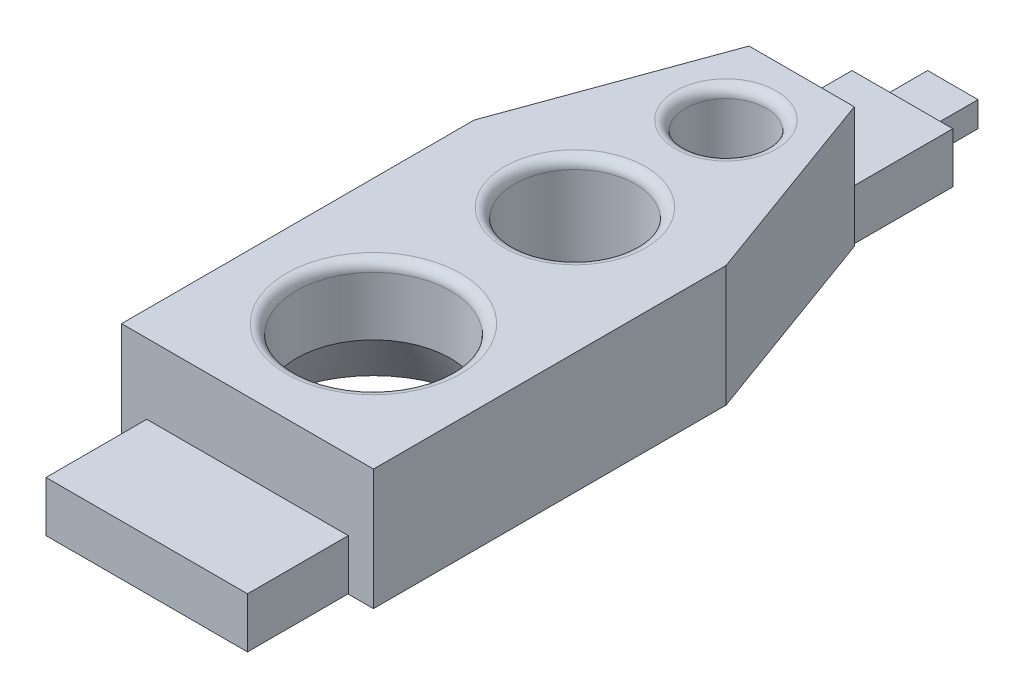
ISO-10303-21;
HEADER;
FILE_DESCRIPTION(('STEP AP214'),'2;1');
FILE_NAME('part.step','',(''),(''),'','','');
FILE_SCHEMA(('AUTOMOTIVE_DESIGN { 1 0 10303 214 1 1 1 1 }'));
ENDSEC;
DATA;
#1=APPLICATION_CONTEXT('core data for automotive mechanical design processes');
#2=APPLICATION_PROTOCOL_DEFINITION('international standard','automotive_design',2000,#1);
#3=PRODUCT_CONTEXT('',#1,'mechanical');
#4=PRODUCT('Part','Part','',(#3));
#5=PRODUCT_RELATED_PRODUCT_CATEGORY('part','',(#4));
#6=PRODUCT_DEFINITION_FORMATION('','',#4);
#7=PRODUCT_DEFINITION_CONTEXT('part definition',#1,'design');
#8=PRODUCT_DEFINITION('design','',#6,#7);
#9=PRODUCT_DEFINITION_SHAPE('','',#8);
#10=(LENGTH_UNIT() NAMED_UNIT(*) SI_UNIT(.MILLI.,.METRE.));
#11=(NAMED_UNIT(*) PLANE_ANGLE_UNIT() SI_UNIT($,.RADIAN.));
#12=(NAMED_UNIT(*) SI_UNIT($,.STERADIAN.) SOLID_ANGLE_UNIT());
#13=UNCERTAINTY_MEASURE_WITH_UNIT(LENGTH_MEASURE(1.E-05),#10,'distance_accuracy_value','');
#14=(GEOMETRIC_REPRESENTATION_CONTEXT(3) GLOBAL_UNCERTAINTY_ASSIGNED_CONTEXT((#13)) GLOBAL_UNIT_ASSIGNED_CONTEXT((#10,
#11,#12)) REPRESENTATION_CONTEXT('',''));
#15=CARTESIAN_POINT('',(0.,0.,0.));
#16=DIRECTION('',(0.,0.,1.));
#17=DIRECTION('',(1.,0.,0.));
#18=AXIS2_PLACEMENT_3D('',#15,#16,#17);
#19=CARTESIAN_POINT('',(0.,0.,4.25));
#20=DIRECTION('',(0.,0.,-1.));
#21=DIRECTION('',(-1.,0.,0.));
#22=AXIS2_PLACEMENT_3D('',#19,#20,#21);
#23=PLANE('',#22);
#24=DIRECTION('',(0.,-1.,0.));
#25=VECTOR('',#24,1.);
#26=CARTESIAN_POINT('',(-1.,0.502908482011137,4.25));
#27=LINE('',#26,#25);
#28=CARTESIAN_POINT('',(-1.,0.502908482011137,4.25));
#29=VERTEX_POINT('',#28);
#30=CARTESIAN_POINT('',(-1.,0.0029084820111366,4.25));
#31=VERTEX_POINT('',#30);
#32=EDGE_CURVE('E188',#29,#31,#27,.T.);
#33=ORIENTED_EDGE('',*,*,#32,.T.);
#34=DIRECTION('',(1.,0.,0.));
#35=VECTOR('',#34,1.);
#36=CARTESIAN_POINT('',(1.,0.00290848201113688,4.25));
#37=LINE('',#36,#35);
#38=CARTESIAN_POINT('',(1.,0.00290848201113688,4.25));
#39=VERTEX_POINT('',#38);
#40=EDGE_CURVE('E191',#31,#39,#37,.T.);
#41=ORIENTED_EDGE('',*,*,#40,.T.);
#42=DIRECTION('',(0.,1.,0.));
#43=VECTOR('',#42,1.);
#44=CARTESIAN_POINT('',(1.,0.502908482011137,4.25));
#45=LINE('',#44,#43);
#46=CARTESIAN_POINT('',(1.,0.502908482011137,4.25));
#47=VERTEX_POINT('',#46);
#48=EDGE_CURVE('E194',#39,#47,#45,.T.);
#49=ORIENTED_EDGE('',*,*,#48,.T.);
#50=DIRECTION('',(-1.,0.,0.));
#51=VECTOR('',#50,1.);
#52=CARTESIAN_POINT('',(1.,0.502908482011137,4.25));
#53=LINE('',#52,#51);
#54=EDGE_CURVE('E196',#47,#29,#53,.T.);
#55=ORIENTED_EDGE('',*,*,#54,.T.);
#56=EDGE_LOOP('',(#33,#41,#49,#55));
#57=FACE_BOUND('',#56,.T.);
#58=ADVANCED_FACE('F33',(#57),#23,.F.);
#59=CARTESIAN_POINT('',(0.,0.,-3.25));
#60=DIRECTION('',(0.,0.,1.));
#61=DIRECTION('',(1.,0.,0.));
#62=AXIS2_PLACEMENT_3D('',#59,#60,#61);
#63=PLANE('',#62);
#64=DIRECTION('',(0.,-1.,0.));
#65=VECTOR('',#64,1.);
#66=CARTESIAN_POINT('',(0.499999999999999,0.500555680922726,-3.25));
#67=LINE('',#66,#65);
#68=CARTESIAN_POINT('',(0.499999999999999,0.500555680922726,-3.25));
#69=VERTEX_POINT('',#68);
#70=CARTESIAN_POINT('',(0.499999999999999,0.000555680922726255,-3.25));
#71=VERTEX_POINT('',#70);
#72=EDGE_CURVE('E218',#69,#71,#67,.T.);
#73=ORIENTED_EDGE('',*,*,#72,.T.);
#74=DIRECTION('',(-1.,0.,0.));
#75=VECTOR('',#74,1.);
#76=CARTESIAN_POINT('',(-0.500000000000001,0.000555680922726363,-3.25));
#77=LINE('',#76,#75);
#78=CARTESIAN_POINT('',(-0.500000000000001,0.000555680922726363,-3.25));
#79=VERTEX_POINT('',#78);
#80=EDGE_CURVE('E221',#71,#79,#77,.T.);
#81=ORIENTED_EDGE('',*,*,#80,.T.);
#82=DIRECTION('',(0.,1.,0.));
#83=VECTOR('',#82,1.);
#84=CARTESIAN_POINT('',(-0.500000000000001,0.500555680922726,-3.25));
#85=LINE('',#84,#83);
#86=CARTESIAN_POINT('',(-0.500000000000001,0.500555680922726,-3.25));
#87=VERTEX_POINT('',#86);
#88=EDGE_CURVE('E224',#79,#87,#85,.T.);
#89=ORIENTED_EDGE('',*,*,#88,.T.);
#90=DIRECTION('',(1.,0.,0.));
#91=VECTOR('',#90,1.);
#92=CARTESIAN_POINT('',(-0.500000000000001,0.500555680922726,-3.25));
#93=LINE('',#92,#91);
#94=EDGE_CURVE('E226',#87,#69,#93,.T.);
#95=ORIENTED_EDGE('',*,*,#94,.T.);
#96=EDGE_LOOP('',(#73,#81,#89,#95));
#97=FACE_BOUND('',#96,.T.);
#98=DIRECTION('',(0.,-1.,0.));
#99=VECTOR('',#98,1.);
#100=CARTESIAN_POINT('',(0.249999999999999,0.125555680922726,-3.25));
#101=LINE('',#100,#99);
#102=CARTESIAN_POINT('',(0.249999999999999,0.375555680922726,-3.25));
#103=VERTEX_POINT('',#102);
#104=CARTESIAN_POINT('',(0.249999999999999,0.125555680922726,-3.25));
#105=VERTEX_POINT('',#104);
#106=EDGE_CURVE('E178',#103,#105,#101,.T.);
#107=ORIENTED_EDGE('',*,*,#106,.F.);
#108=DIRECTION('',(1.,0.,0.));
#109=VECTOR('',#108,1.);
#110=CARTESIAN_POINT('',(-0.250000000000001,0.375555680922726,-3.25));
#111=LINE('',#110,#109);
#112=CARTESIAN_POINT('',(-0.250000000000001,0.375555680922726,-3.25));
#113=VERTEX_POINT('',#112);
#114=EDGE_CURVE('E175',#113,#103,#111,.T.);
#115=ORIENTED_EDGE('',*,*,#114,.F.);
#116=DIRECTION('',(0.,1.,0.));
#117=VECTOR('',#116,1.);
#118=CARTESIAN_POINT('',(-0.250000000000001,0.125555680922726,-3.25));
#119=LINE('',#118,#117);
#120=CARTESIAN_POINT('',(-0.250000000000001,0.125555680922726,-3.25));
#121=VERTEX_POINT('',#120);
#122=EDGE_CURVE('E53',#121,#113,#119,.T.);
#123=ORIENTED_EDGE('',*,*,#122,.F.);
#124=DIRECTION('',(-1.,0.,0.));
#125=VECTOR('',#124,1.);
#126=CARTESIAN_POINT('',(-0.250000000000001,0.125555680922726,-3.25));
#127=LINE('',#126,#125);
#128=EDGE_CURVE('E48',#105,#121,#127,.T.);
#129=ORIENTED_EDGE('',*,*,#128,.F.);
#130=EDGE_LOOP('',(#107,#115,#123,#129));
#131=FACE_BOUND('',#130,.T.);
#132=ADVANCED_FACE('F385',(#97,#131),#63,.F.);
#133=CARTESIAN_POINT('',(1.25,1.2,3.25));
#134=DIRECTION('',(0.,0.,-1.));
#135=DIRECTION('',(-1.,0.,0.));
#136=AXIS2_PLACEMENT_3D('',#133,#134,#135);
#137=PLANE('',#136);
#138=DIRECTION('',(1.,0.,0.));
#139=VECTOR('',#138,1.);
#140=CARTESIAN_POINT('',(1.25,0.,3.25));
#141=LINE('',#140,#139);
#142=CARTESIAN_POINT('',(-1.25,0.,3.25));
#143=VERTEX_POINT('',#142);
#144=CARTESIAN_POINT('',(1.25,0.,3.25));
#145=VERTEX_POINT('',#144);
#146=EDGE_CURVE('E264',#143,#145,#141,.T.);
#147=ORIENTED_EDGE('',*,*,#146,.T.);
#148=DIRECTION('',(0.,-1.,0.));
#149=VECTOR('',#148,1.);
#150=CARTESIAN_POINT('',(1.25,1.2,3.25));
#151=LINE('',#150,#149);
#152=CARTESIAN_POINT('',(1.25,1.2,3.25));
#153=VERTEX_POINT('',#152);
#154=EDGE_CURVE('E262',#153,#145,#151,.T.);
#155=ORIENTED_EDGE('',*,*,#154,.F.);
#156=DIRECTION('',(1.,0.,0.));
#157=VECTOR('',#156,1.);
#158=CARTESIAN_POINT('',(1.25,1.2,3.25));
#159=LINE('',#158,#157);
#160=CARTESIAN_POINT('',(-1.25,1.2,3.25));
#161=VERTEX_POINT('',#160);
#162=EDGE_CURVE('E256',#161,#153,#159,.T.);
#163=ORIENTED_EDGE('',*,*,#162,.F.);
#164=DIRECTION('',(0.,-1.,0.));
#165=VECTOR('',#164,1.);
#166=CARTESIAN_POINT('',(-1.25,1.2,3.25));
#167=LINE('',#166,#165);
#168=EDGE_CURVE('E270',#161,#143,#167,.T.);
#169=ORIENTED_EDGE('',*,*,#168,.T.);
#170=EDGE_LOOP('',(#147,#155,#163,#169));
#171=FACE_BOUND('',#170,.T.);
#172=DIRECTION('',(0.,-1.,0.));
#173=VECTOR('',#172,1.);
#174=CARTESIAN_POINT('',(-1.,0.502908482011137,3.25));
#175=LINE('',#174,#173);
#176=CARTESIAN_POINT('',(-1.,0.502908482011137,3.25));
#177=VERTEX_POINT('',#176);
#178=CARTESIAN_POINT('',(-1.,0.00290848201113646,3.25));
#179=VERTEX_POINT('',#178);
#180=EDGE_CURVE('E179',#177,#179,#175,.T.);
#181=ORIENTED_EDGE('',*,*,#180,.F.);
#182=DIRECTION('',(-1.,0.,0.));
#183=VECTOR('',#182,1.);
#184=CARTESIAN_POINT('',(1.,0.502908482011137,3.25));
#185=LINE('',#184,#183);
#186=CARTESIAN_POINT('',(1.,0.502908482011137,3.25));
#187=VERTEX_POINT('',#186);
#188=EDGE_CURVE('E192',#187,#177,#185,.T.);
#189=ORIENTED_EDGE('',*,*,#188,.F.);
#190=DIRECTION('',(0.,1.,0.));
#191=VECTOR('',#190,1.);
#192=CARTESIAN_POINT('',(1.,0.502908482011137,3.25));
#193=LINE('',#192,#191);
#194=CARTESIAN_POINT('',(1.,0.00290848201113677,3.25));
#195=VERTEX_POINT('',#194);
#196=EDGE_CURVE('E201',#195,#187,#193,.T.);
#197=ORIENTED_EDGE('',*,*,#196,.F.);
#198=DIRECTION('',(1.,0.,0.));
#199=VECTOR('',#198,1.);
#200=CARTESIAN_POINT('',(1.,0.00290848201113688,3.25));
#201=LINE('',#200,#199);
#202=EDGE_CURVE('E182',#179,#195,#201,.T.);
#203=ORIENTED_EDGE('',*,*,#202,.F.);
#204=EDGE_LOOP('',(#181,#189,#197,#203));
#205=FACE_BOUND('',#204,.T.);
#206=ADVANCED_FACE('F357',(#171,#205),#137,.F.);
#207=CARTESIAN_POINT('',(0.,0.,-2.25));
#208=DIRECTION('',(0.,0.,-1.));
#209=DIRECTION('',(-1.,0.,0.));
#210=AXIS2_PLACEMENT_3D('',#207,#208,#209);
#211=PLANE('',#210);
#212=DIRECTION('',(-1.,0.,0.));
#213=VECTOR('',#212,1.);
#214=CARTESIAN_POINT('',(1.25,0.,-2.25));
#215=LINE('',#214,#213);
#216=CARTESIAN_POINT('',(0.522059531467591,0.,-2.25));
#217=VERTEX_POINT('',#216);
#218=CARTESIAN_POINT('',(-0.52205953146759,0.,-2.25));
#219=VERTEX_POINT('',#218);
#220=EDGE_CURVE('E246',#217,#219,#215,.T.);
#221=ORIENTED_EDGE('',*,*,#220,.T.);
#222=DIRECTION('',(0.,1.,0.));
#223=VECTOR('',#222,1.);
#224=CARTESIAN_POINT('',(-0.522059531467589,1.2,-2.25));
#225=LINE('',#224,#223);
#226=CARTESIAN_POINT('',(-0.522059531467589,1.2,-2.25));
#227=VERTEX_POINT('',#226);
#228=EDGE_CURVE('E288',#227,#219,#225,.F.);
#229=ORIENTED_EDGE('',*,*,#228,.F.);
#230=DIRECTION('',(1.,0.,0.));
#231=VECTOR('',#230,1.);
#232=CARTESIAN_POINT('',(1.25,1.2,-2.25));
#233=LINE('',#232,#231);
#234=CARTESIAN_POINT('',(0.522059531467591,1.2,-2.25));
#235=VERTEX_POINT('',#234);
#236=EDGE_CURVE('E248',#227,#235,#233,.T.);
#237=ORIENTED_EDGE('',*,*,#236,.T.);
#238=DIRECTION('',(0.,-1.,0.));
#239=VECTOR('',#238,1.);
#240=CARTESIAN_POINT('',(0.522059531467591,1.2,-2.25));
#241=LINE('',#240,#239);
#242=EDGE_CURVE('E250',#217,#235,#241,.F.);
#243=ORIENTED_EDGE('',*,*,#242,.F.);
#244=EDGE_LOOP('',(#221,#229,#237,#243));
#245=FACE_BOUND('',#244,.T.);
#246=DIRECTION('',(-1.,0.,0.));
#247=VECTOR('',#246,1.);
#248=CARTESIAN_POINT('',(-0.500000000000001,0.000555680922726363,-2.25));
#249=LINE('',#248,#247);
#250=CARTESIAN_POINT('',(0.499999999999999,0.000555680922726255,-2.25));
#251=VERTEX_POINT('',#250);
#252=CARTESIAN_POINT('',(-0.500000000000001,0.000555680922726363,-2.25));
#253=VERTEX_POINT('',#252);
#254=EDGE_CURVE('E231',#251,#253,#249,.T.);
#255=ORIENTED_EDGE('',*,*,#254,.F.);
#256=DIRECTION('',(0.,-1.,0.));
#257=VECTOR('',#256,1.);
#258=CARTESIAN_POINT('',(0.499999999999999,0.500555680922726,-2.25));
#259=LINE('',#258,#257);
#260=CARTESIAN_POINT('',(0.499999999999999,0.500555680922726,-2.25));
#261=VERTEX_POINT('',#260);
#262=EDGE_CURVE('E217',#261,#251,#259,.T.);
#263=ORIENTED_EDGE('',*,*,#262,.F.);
#264=DIRECTION('',(1.,0.,0.));
#265=VECTOR('',#264,1.);
#266=CARTESIAN_POINT('',(-0.500000000000001,0.500555680922726,-2.25));
#267=LINE('',#266,#265);
#268=CARTESIAN_POINT('',(-0.500000000000001,0.500555680922726,-2.25));
#269=VERTEX_POINT('',#268);
#270=EDGE_CURVE('E222',#269,#261,#267,.T.);
#271=ORIENTED_EDGE('',*,*,#270,.F.);
#272=DIRECTION('',(0.,1.,0.));
#273=VECTOR('',#272,1.);
#274=CARTESIAN_POINT('',(-0.500000000000001,0.500555680922726,-2.25));
#275=LINE('',#274,#273);
#276=EDGE_CURVE('E233',#253,#269,#275,.T.);
#277=ORIENTED_EDGE('',*,*,#276,.F.);
#278=EDGE_LOOP('',(#255,#263,#271,#277));
#279=FACE_BOUND('',#278,.T.);
#280=ADVANCED_FACE('F367',(#245,#279),#211,.T.);
#281=CARTESIAN_POINT('',(0.,1.2,0.));
#282=DIRECTION('',(0.,-1.,0.));
#283=DIRECTION('',(0.,0.,-1.));
#284=AXIS2_PLACEMENT_3D('',#281,#282,#283);
#285=PLANE('',#284);
#286=CARTESIAN_POINT('',(0.,1.2,0.));
#287=DIRECTION('',(0.,-1.,0.));
#288=DIRECTION('',(0.,0.,-1.));
#289=AXIS2_PLACEMENT_3D('',#286,#287,#288);
#290=CIRCLE('',#289,0.7);
#291=CARTESIAN_POINT('',(0.,1.2,-0.7));
#292=VERTEX_POINT('',#291);
#293=EDGE_CURVE('E315',#292,#292,#290,.T.);
#294=ORIENTED_EDGE('',*,*,#293,.T.);
#295=EDGE_LOOP('',(#294));
#296=FACE_BOUND('',#295,.T.);
#297=CARTESIAN_POINT('',(0.,1.2,2.));
#298=DIRECTION('',(0.,-1.,0.));
#299=DIRECTION('',(0.,0.,-1.));
#300=AXIS2_PLACEMENT_3D('',#297,#298,#299);
#301=CIRCLE('',#300,0.865);
#302=CARTESIAN_POINT('',(0.,1.2,1.135));
#303=VERTEX_POINT('',#302);
#304=EDGE_CURVE('E312',#303,#303,#301,.T.);
#305=ORIENTED_EDGE('',*,*,#304,.T.);
#306=EDGE_LOOP('',(#305));
#307=FACE_BOUND('',#306,.T.);
#308=CARTESIAN_POINT('',(-0.00176660570866817,1.2,-1.5));
#309=DIRECTION('',(0.,-1.,0.));
#310=DIRECTION('',(0.,0.,-1.));
#311=AXIS2_PLACEMENT_3D('',#308,#309,#310);
#312=CIRCLE('',#311,0.5);
#313=CARTESIAN_POINT('',(-0.00176660570866817,1.2,-2.));
#314=VERTEX_POINT('',#313);
#315=EDGE_CURVE('E309',#314,#314,#312,.T.);
#316=ORIENTED_EDGE('',*,*,#315,.T.);
#317=EDGE_LOOP('',(#316));
#318=FACE_BOUND('',#317,.T.);
#319=ORIENTED_EDGE('',*,*,#236,.F.);
#320=DIRECTION('',(0.342020143325666,0.,-0.939692620785909));
#321=VECTOR('',#320,1.);
#322=CARTESIAN_POINT('',(-1.25,1.2,-0.249999999999968));
#323=LINE('',#322,#321);
#324=CARTESIAN_POINT('',(-1.25,1.2,-0.249999999999973));
#325=VERTEX_POINT('',#324);
#326=EDGE_CURVE('E286',#227,#325,#323,.F.);
#327=ORIENTED_EDGE('',*,*,#326,.T.);
#328=DIRECTION('',(0.,0.,1.));
#329=VECTOR('',#328,1.);
#330=CARTESIAN_POINT('',(-1.25,1.2,-3.25));
#331=LINE('',#330,#329);
#332=EDGE_CURVE('E254',#325,#161,#331,.T.);
#333=ORIENTED_EDGE('',*,*,#332,.T.);
#334=ORIENTED_EDGE('',*,*,#162,.T.);
#335=DIRECTION('',(0.,0.,-1.));
#336=VECTOR('',#335,1.);
#337=CARTESIAN_POINT('',(1.25,1.2,-3.25));
#338=LINE('',#337,#336);
#339=CARTESIAN_POINT('',(1.25,1.2,-0.249999999999973));
#340=VERTEX_POINT('',#339);
#341=EDGE_CURVE('E259',#153,#340,#338,.T.);
#342=ORIENTED_EDGE('',*,*,#341,.T.);
#343=DIRECTION('',(0.342020143325667,0.,0.939692620785909));
#344=VECTOR('',#343,1.);
#345=CARTESIAN_POINT('',(0.158089297201391,1.2,-3.25));
#346=LINE('',#345,#344);
#347=EDGE_CURVE('E277',#340,#235,#346,.F.);
#348=ORIENTED_EDGE('',*,*,#347,.T.);
#349=EDGE_LOOP('',(#319,#327,#333,#334,#342,#348));
#350=FACE_BOUND('',#349,.T.);
#351=ADVANCED_FACE('F335',(#296,#307,#318,#350),#285,.F.);
#352=CARTESIAN_POINT('',(0.,0.,0.));
#353=DIRECTION('',(0.,-1.,0.));
#354=DIRECTION('',(0.,0.,-1.));
#355=AXIS2_PLACEMENT_3D('',#352,#353,#354);
#356=PLANE('',#355);
#357=CARTESIAN_POINT('',(0.,0.,0.));
#358=DIRECTION('',(0.,-1.,0.));
#359=DIRECTION('',(0.,0.,-1.));
#360=AXIS2_PLACEMENT_3D('',#357,#358,#359);
#361=CIRCLE('',#360,0.7);
#362=CARTESIAN_POINT('',(0.,0.,-0.7));
#363=VERTEX_POINT('',#362);
#364=EDGE_CURVE('E300',#363,#363,#361,.F.);
#365=ORIENTED_EDGE('',*,*,#364,.T.);
#366=EDGE_LOOP('',(#365));
#367=FACE_BOUND('',#366,.T.);
#368=CARTESIAN_POINT('',(-0.00176660570866817,0.,-1.5));
#369=DIRECTION('',(0.,-1.,0.));
#370=DIRECTION('',(0.,0.,-1.));
#371=AXIS2_PLACEMENT_3D('',#368,#369,#370);
#372=CIRCLE('',#371,0.5);
#373=CARTESIAN_POINT('',(-0.00176660570866817,0.,-2.));
#374=VERTEX_POINT('',#373);
#375=EDGE_CURVE('E297',#374,#374,#372,.F.);
#376=ORIENTED_EDGE('',*,*,#375,.T.);
#377=EDGE_LOOP('',(#376));
#378=FACE_BOUND('',#377,.T.);
#379=CARTESIAN_POINT('',(0.,0.,2.));
#380=DIRECTION('',(0.,-1.,0.));
#381=DIRECTION('',(0.,0.,-1.));
#382=AXIS2_PLACEMENT_3D('',#379,#380,#381);
#383=CIRCLE('',#382,1.065);
#384=CARTESIAN_POINT('',(0.,0.,0.934999999999998));
#385=VERTEX_POINT('',#384);
#386=EDGE_CURVE('E291',#385,#385,#383,.F.);
#387=ORIENTED_EDGE('',*,*,#386,.T.);
#388=EDGE_LOOP('',(#387));
#389=FACE_BOUND('',#388,.T.);
#390=DIRECTION('',(-0.342020143325666,0.,0.939692620785909));
#391=VECTOR('',#390,1.);
#392=CARTESIAN_POINT('',(-1.18412622816017,0.,-0.430986700664208));
#393=LINE('',#392,#391);
#394=CARTESIAN_POINT('',(-1.25,0.,-0.249999999999973));
#395=VERTEX_POINT('',#394);
#396=EDGE_CURVE('E283',#395,#219,#393,.F.);
#397=ORIENTED_EDGE('',*,*,#396,.T.);
#398=ORIENTED_EDGE('',*,*,#220,.F.);
#399=DIRECTION('',(-0.342020143325667,0.,-0.939692620785909));
#400=VECTOR('',#399,1.);
#401=CARTESIAN_POINT('',(1.18412622816017,0.,-0.430986700664209));
#402=LINE('',#401,#400);
#403=CARTESIAN_POINT('',(1.25,0.,-0.249999999999973));
#404=VERTEX_POINT('',#403);
#405=EDGE_CURVE('E273',#217,#404,#402,.F.);
#406=ORIENTED_EDGE('',*,*,#405,.T.);
#407=DIRECTION('',(0.,0.,-1.));
#408=VECTOR('',#407,1.);
#409=CARTESIAN_POINT('',(1.25,0.,-3.25));
#410=LINE('',#409,#408);
#411=EDGE_CURVE('E257',#145,#404,#410,.T.);
#412=ORIENTED_EDGE('',*,*,#411,.F.);
#413=ORIENTED_EDGE('',*,*,#146,.F.);
#414=DIRECTION('',(0.,0.,1.));
#415=VECTOR('',#414,1.);
#416=CARTESIAN_POINT('',(-1.25,0.,-3.25));
#417=LINE('',#416,#415);
#418=EDGE_CURVE('E253',#395,#143,#417,.T.);
#419=ORIENTED_EDGE('',*,*,#418,.F.);
#420=EDGE_LOOP('',(#397,#398,#406,#412,#413,#419));
#421=FACE_BOUND('',#420,.T.);
#422=ADVANCED_FACE('F331',(#367,#378,#389,#421),#356,.T.);
#423=CARTESIAN_POINT('',(0.158089297201391,1.2,-3.25));
#424=DIRECTION('',(-0.939692620785909,0.,0.342020143325667));
#425=DIRECTION('',(0.,-1.,0.));
#426=AXIS2_PLACEMENT_3D('',#423,#424,#425);
#427=PLANE('',#426);
#428=ORIENTED_EDGE('',*,*,#405,.F.);
#429=ORIENTED_EDGE('',*,*,#242,.T.);
#430=ORIENTED_EDGE('',*,*,#347,.F.);
#431=DIRECTION('',(0.,1.,0.));
#432=VECTOR('',#431,1.);
#433=CARTESIAN_POINT('',(1.25,1.2,-0.249999999999972));
#434=LINE('',#433,#432);
#435=EDGE_CURVE('E275',#404,#340,#434,.T.);
#436=ORIENTED_EDGE('',*,*,#435,.F.);
#437=EDGE_LOOP('',(#428,#429,#430,#436));
#438=FACE_BOUND('',#437,.T.);
#439=ADVANCED_FACE('F334',(#438),#427,.F.);
#440=CARTESIAN_POINT('',(-1.25,1.2,-0.249999999999968));
#441=DIRECTION('',(0.939692620785909,0.,0.342020143325666));
#442=DIRECTION('',(0.,-1.,0.));
#443=AXIS2_PLACEMENT_3D('',#440,#441,#442);
#444=PLANE('',#443);
#445=ORIENTED_EDGE('',*,*,#326,.F.);
#446=ORIENTED_EDGE('',*,*,#228,.T.);
#447=ORIENTED_EDGE('',*,*,#396,.F.);
#448=DIRECTION('',(0.,-1.,0.));
#449=VECTOR('',#448,1.);
#450=CARTESIAN_POINT('',(-1.25,1.2,-0.249999999999968));
#451=LINE('',#450,#449);
#452=EDGE_CURVE('E280',#325,#395,#451,.T.);
#453=ORIENTED_EDGE('',*,*,#452,.F.);
#454=EDGE_LOOP('',(#445,#446,#447,#453));
#455=FACE_BOUND('',#454,.T.);
#456=ADVANCED_FACE('F347',(#455),#444,.F.);
#457=CARTESIAN_POINT('',(-1.25,1.2,-3.25));
#458=DIRECTION('',(1.,0.,0.));
#459=DIRECTION('',(0.,0.,-1.));
#460=AXIS2_PLACEMENT_3D('',#457,#458,#459);
#461=PLANE('',#460);
#462=ORIENTED_EDGE('',*,*,#332,.F.);
#463=ORIENTED_EDGE('',*,*,#452,.T.);
#464=ORIENTED_EDGE('',*,*,#418,.T.);
#465=ORIENTED_EDGE('',*,*,#168,.F.);
#466=EDGE_LOOP('',(#462,#463,#464,#465));
#467=FACE_BOUND('',#466,.T.);
#468=ADVANCED_FACE('F350',(#467),#461,.F.);
#469=CARTESIAN_POINT('',(1.25,1.2,-3.25));
#470=DIRECTION('',(-1.,0.,0.));
#471=DIRECTION('',(0.,0.,1.));
#472=AXIS2_PLACEMENT_3D('',#469,#470,#471);
#473=PLANE('',#472);
#474=ORIENTED_EDGE('',*,*,#411,.T.);
#475=ORIENTED_EDGE('',*,*,#435,.T.);
#476=ORIENTED_EDGE('',*,*,#341,.F.);
#477=ORIENTED_EDGE('',*,*,#154,.T.);
#478=EDGE_LOOP('',(#474,#475,#476,#477));
#479=FACE_BOUND('',#478,.T.);
#480=ADVANCED_FACE('F362',(#479),#473,.F.);
#481=CARTESIAN_POINT('',(0.,0.,0.));
#482=DIRECTION('',(0.,1.,0.));
#483=DIRECTION('',(0.,0.,1.));
#484=AXIS2_PLACEMENT_3D('',#481,#482,#483);
#485=CYLINDRICAL_SURFACE('',#484,0.6);
#486=CARTESIAN_POINT('',(0.,0.1,0.));
#487=DIRECTION('',(0.,-1.,0.));
#488=DIRECTION('',(0.,0.,-1.));
#489=AXIS2_PLACEMENT_3D('',#486,#487,#488);
#490=CIRCLE('',#489,0.6);
#491=CARTESIAN_POINT('',(0.,0.1,-0.6));
#492=VERTEX_POINT('',#491);
#493=EDGE_CURVE('E306',#492,#492,#490,.T.);
#494=ORIENTED_EDGE('',*,*,#493,.T.);
#495=EDGE_LOOP('',(#494));
#496=FACE_BOUND('',#495,.T.);
#497=CARTESIAN_POINT('',(0.,1.1,0.));
#498=DIRECTION('',(0.,-1.,0.));
#499=DIRECTION('',(0.,0.,-1.));
#500=AXIS2_PLACEMENT_3D('',#497,#498,#499);
#501=CIRCLE('',#500,0.6);
#502=CARTESIAN_POINT('',(0.,1.1,-0.6));
#503=VERTEX_POINT('',#502);
#504=EDGE_CURVE('E303',#503,#503,#501,.F.);
#505=ORIENTED_EDGE('',*,*,#504,.T.);
#506=EDGE_LOOP('',(#505));
#507=FACE_BOUND('',#506,.T.);
#508=ADVANCED_FACE('F473',(#496,#507),#485,.F.);
#509=CARTESIAN_POINT('',(0.,0.,2.));
#510=DIRECTION('',(0.,1.,0.));
#511=DIRECTION('',(0.,0.,1.));
#512=AXIS2_PLACEMENT_3D('',#509,#510,#511);
#513=CYLINDRICAL_SURFACE('',#512,0.765);
#514=CARTESIAN_POINT('',(0.,1.1,2.));
#515=DIRECTION('',(0.,-1.,0.));
#516=DIRECTION('',(0.,0.,-1.));
#517=AXIS2_PLACEMENT_3D('',#514,#515,#516);
#518=CIRCLE('',#517,0.765);
#519=CARTESIAN_POINT('',(0.,1.1,1.235));
#520=VERTEX_POINT('',#519);
#521=EDGE_CURVE('E318',#520,#520,#518,.F.);
#522=ORIENTED_EDGE('',*,*,#521,.T.);
#523=EDGE_LOOP('',(#522));
#524=FACE_BOUND('',#523,.T.);
#525=CARTESIAN_POINT('',(0.,0.519615242270663,2.));
#526=DIRECTION('',(0.,-1.,0.));
#527=DIRECTION('',(0.,0.,-1.));
#528=AXIS2_PLACEMENT_3D('',#525,#526,#527);
#529=CIRCLE('',#528,0.765);
#530=CARTESIAN_POINT('',(0.,0.519615242270663,1.235));
#531=VERTEX_POINT('',#530);
#532=EDGE_CURVE('E294',#531,#531,#529,.T.);
#533=ORIENTED_EDGE('',*,*,#532,.T.);
#534=EDGE_LOOP('',(#533));
#535=FACE_BOUND('',#534,.T.);
#536=ADVANCED_FACE('F468',(#524,#535),#513,.F.);
#537=CARTESIAN_POINT('',(-0.00176660570866817,0.,-1.5));
#538=DIRECTION('',(0.,1.,0.));
#539=DIRECTION('',(0.,0.,1.));
#540=AXIS2_PLACEMENT_3D('',#537,#538,#539);
#541=CYLINDRICAL_SURFACE('',#540,0.4);
#542=CARTESIAN_POINT('',(-0.00176660570866817,1.1,-1.5));
#543=DIRECTION('',(0.,-1.,0.));
#544=DIRECTION('',(0.,0.,-1.));
#545=AXIS2_PLACEMENT_3D('',#542,#543,#544);
#546=CIRCLE('',#545,0.4);
#547=CARTESIAN_POINT('',(-0.00176660570866817,1.1,-1.9));
#548=VERTEX_POINT('',#547);
#549=EDGE_CURVE('E11',#548,#548,#546,.F.);
#550=ORIENTED_EDGE('',*,*,#549,.T.);
#551=EDGE_LOOP('',(#550));
#552=FACE_BOUND('',#551,.T.);
#553=CARTESIAN_POINT('',(-0.00176660570866817,0.1,-1.5));
#554=DIRECTION('',(0.,-1.,0.));
#555=DIRECTION('',(0.,0.,-1.));
#556=AXIS2_PLACEMENT_3D('',#553,#554,#555);
#557=CIRCLE('',#556,0.4);
#558=CARTESIAN_POINT('',(-0.00176660570866817,0.1,-1.9));
#559=VERTEX_POINT('',#558);
#560=EDGE_CURVE('E41',#559,#559,#557,.T.);
#561=ORIENTED_EDGE('',*,*,#560,.T.);
#562=EDGE_LOOP('',(#561));
#563=FACE_BOUND('',#562,.T.);
#564=ADVANCED_FACE('F323',(#552,#563),#541,.F.);
#565=CARTESIAN_POINT('',(0.,0.,2.));
#566=DIRECTION('',(0.,-1.,0.));
#567=DIRECTION('',(0.,0.,-1.));
#568=AXIS2_PLACEMENT_3D('',#565,#566,#567);
#569=CONICAL_SURFACE('',#568,1.065,0.523598775598301);
#570=ORIENTED_EDGE('',*,*,#532,.F.);
#571=EDGE_LOOP('',(#570));
#572=FACE_BOUND('',#571,.T.);
#573=ORIENTED_EDGE('',*,*,#386,.F.);
#574=EDGE_LOOP('',(#573));
#575=FACE_BOUND('',#574,.T.);
#576=ADVANCED_FACE('F444',(#572,#575),#569,.F.);
#577=CARTESIAN_POINT('',(0.,0.1,0.));
#578=DIRECTION('',(0.,-1.,0.));
#579=DIRECTION('',(0.,0.,-1.));
#580=AXIS2_PLACEMENT_3D('',#577,#578,#579);
#581=TOROIDAL_SURFACE('',#580,0.7,0.1);
#582=ORIENTED_EDGE('',*,*,#493,.F.);
#583=EDGE_LOOP('',(#582));
#584=FACE_BOUND('',#583,.T.);
#585=ORIENTED_EDGE('',*,*,#364,.F.);
#586=EDGE_LOOP('',(#585));
#587=FACE_BOUND('',#586,.T.);
#588=ADVANCED_FACE('F447',(#584,#587),#581,.T.);
#589=CARTESIAN_POINT('',(0.,1.1,0.));
#590=DIRECTION('',(0.,-1.,0.));
#591=DIRECTION('',(0.,0.,-1.));
#592=AXIS2_PLACEMENT_3D('',#589,#590,#591);
#593=TOROIDAL_SURFACE('',#592,0.7,0.1);
#594=ORIENTED_EDGE('',*,*,#293,.F.);
#595=EDGE_LOOP('',(#594));
#596=FACE_BOUND('',#595,.T.);
#597=ORIENTED_EDGE('',*,*,#504,.F.);
#598=EDGE_LOOP('',(#597));
#599=FACE_BOUND('',#598,.T.);
#600=ADVANCED_FACE('F451',(#596,#599),#593,.T.);
#601=CARTESIAN_POINT('',(0.,1.1,2.));
#602=DIRECTION('',(0.,-1.,0.));
#603=DIRECTION('',(0.,0.,-1.));
#604=AXIS2_PLACEMENT_3D('',#601,#602,#603);
#605=TOROIDAL_SURFACE('',#604,0.865,0.1);
#606=ORIENTED_EDGE('',*,*,#304,.F.);
#607=EDGE_LOOP('',(#606));
#608=FACE_BOUND('',#607,.T.);
#609=ORIENTED_EDGE('',*,*,#521,.F.);
#610=EDGE_LOOP('',(#609));
#611=FACE_BOUND('',#610,.T.);
#612=ADVANCED_FACE('F455',(#608,#611),#605,.T.);
#613=CARTESIAN_POINT('',(-0.00176660570866817,1.1,-1.5));
#614=DIRECTION('',(0.,-1.,0.));
#615=DIRECTION('',(0.,0.,-1.));
#616=AXIS2_PLACEMENT_3D('',#613,#614,#615);
#617=TOROIDAL_SURFACE('',#616,0.5,0.1);
#618=ORIENTED_EDGE('',*,*,#315,.F.);
#619=EDGE_LOOP('',(#618));
#620=FACE_BOUND('',#619,.T.);
#621=ORIENTED_EDGE('',*,*,#549,.F.);
#622=EDGE_LOOP('',(#621));
#623=FACE_BOUND('',#622,.T.);
#624=ADVANCED_FACE('F328',(#620,#623),#617,.T.);
#625=CARTESIAN_POINT('',(-0.00176660570866817,0.1,-1.5));
#626=DIRECTION('',(0.,-1.,0.));
#627=DIRECTION('',(0.,0.,-1.));
#628=AXIS2_PLACEMENT_3D('',#625,#626,#627);
#629=TOROIDAL_SURFACE('',#628,0.5,0.1);
#630=ORIENTED_EDGE('',*,*,#560,.F.);
#631=EDGE_LOOP('',(#630));
#632=FACE_BOUND('',#631,.T.);
#633=ORIENTED_EDGE('',*,*,#375,.F.);
#634=EDGE_LOOP('',(#633));
#635=FACE_BOUND('',#634,.T.);
#636=ADVANCED_FACE('F35',(#632,#635),#629,.T.);
#637=CARTESIAN_POINT('',(0.499999999999999,0.500555680922726,-3.25));
#638=DIRECTION('',(-1.,0.,0.));
#639=DIRECTION('',(0.,0.,1.));
#640=AXIS2_PLACEMENT_3D('',#637,#638,#639);
#641=PLANE('',#640);
#642=ORIENTED_EDGE('',*,*,#262,.T.);
#643=DIRECTION('',(0.,0.,1.));
#644=VECTOR('',#643,1.);
#645=CARTESIAN_POINT('',(0.499999999999999,0.000555680922726255,-3.25));
#646=LINE('',#645,#644);
#647=EDGE_CURVE('E244',#71,#251,#646,.T.);
#648=ORIENTED_EDGE('',*,*,#647,.F.);
#649=ORIENTED_EDGE('',*,*,#72,.F.);
#650=DIRECTION('',(0.,0.,1.));
#651=VECTOR('',#650,1.);
#652=CARTESIAN_POINT('',(0.499999999999999,0.500555680922726,-3.25));
#653=LINE('',#652,#651);
#654=EDGE_CURVE('E228',#69,#261,#653,.T.);
#655=ORIENTED_EDGE('',*,*,#654,.T.);
#656=EDGE_LOOP('',(#642,#648,#649,#655));
#657=FACE_BOUND('',#656,.T.);
#658=ADVANCED_FACE('F327',(#657),#641,.F.);
#659=CARTESIAN_POINT('',(-0.500000000000001,0.000555680922726363,-3.25));
#660=DIRECTION('',(0.,1.,0.));
#661=DIRECTION('',(-1.,0.,0.));
#662=AXIS2_PLACEMENT_3D('',#659,#660,#661);
#663=PLANE('',#662);
#664=ORIENTED_EDGE('',*,*,#254,.T.);
#665=DIRECTION('',(0.,0.,1.));
#666=VECTOR('',#665,1.);
#667=CARTESIAN_POINT('',(-0.500000000000001,0.000555680922726363,-3.25));
#668=LINE('',#667,#666);
#669=EDGE_CURVE('E241',#79,#253,#668,.T.);
#670=ORIENTED_EDGE('',*,*,#669,.F.);
#671=ORIENTED_EDGE('',*,*,#80,.F.);
#672=ORIENTED_EDGE('',*,*,#647,.T.);
#673=EDGE_LOOP('',(#664,#670,#671,#672));
#674=FACE_BOUND('',#673,.T.);
#675=ADVANCED_FACE('F377',(#674),#663,.F.);
#676=CARTESIAN_POINT('',(-0.500000000000001,0.500555680922726,-3.25));
#677=DIRECTION('',(1.,0.,0.));
#678=DIRECTION('',(0.,0.,-1.));
#679=AXIS2_PLACEMENT_3D('',#676,#677,#678);
#680=PLANE('',#679);
#681=ORIENTED_EDGE('',*,*,#276,.T.);
#682=DIRECTION('',(0.,0.,1.));
#683=VECTOR('',#682,1.);
#684=CARTESIAN_POINT('',(-0.500000000000001,0.500555680922726,-3.25));
#685=LINE('',#684,#683);
#686=EDGE_CURVE('E239',#87,#269,#685,.T.);
#687=ORIENTED_EDGE('',*,*,#686,.F.);
#688=ORIENTED_EDGE('',*,*,#88,.F.);
#689=ORIENTED_EDGE('',*,*,#669,.T.);
#690=EDGE_LOOP('',(#681,#687,#688,#689));
#691=FACE_BOUND('',#690,.T.);
#692=ADVANCED_FACE('F381',(#691),#680,.F.);
#693=CARTESIAN_POINT('',(-0.500000000000001,0.500555680922726,-3.25));
#694=DIRECTION('',(0.,-1.,0.));
#695=DIRECTION('',(1.,0.,0.));
#696=AXIS2_PLACEMENT_3D('',#693,#694,#695);
#697=PLANE('',#696);
#698=ORIENTED_EDGE('',*,*,#270,.T.);
#699=ORIENTED_EDGE('',*,*,#654,.F.);
#700=ORIENTED_EDGE('',*,*,#94,.F.);
#701=ORIENTED_EDGE('',*,*,#686,.T.);
#702=EDGE_LOOP('',(#698,#699,#700,#701));
#703=FACE_BOUND('',#702,.T.);
#704=ADVANCED_FACE('F390',(#703),#697,.F.);
#705=CARTESIAN_POINT('',(-1.,0.502908482011137,4.25));
#706=DIRECTION('',(1.,0.,0.));
#707=DIRECTION('',(0.,0.,-1.));
#708=AXIS2_PLACEMENT_3D('',#705,#706,#707);
#709=PLANE('',#708);
#710=ORIENTED_EDGE('',*,*,#180,.T.);
#711=DIRECTION('',(0.,0.,-1.));
#712=VECTOR('',#711,1.);
#713=CARTESIAN_POINT('',(-1.,0.0029084820111366,4.25));
#714=LINE('',#713,#712);
#715=EDGE_CURVE('E214',#31,#179,#714,.T.);
#716=ORIENTED_EDGE('',*,*,#715,.F.);
#717=ORIENTED_EDGE('',*,*,#32,.F.);
#718=DIRECTION('',(0.,0.,-1.));
#719=VECTOR('',#718,1.);
#720=CARTESIAN_POINT('',(-1.,0.502908482011137,4.25));
#721=LINE('',#720,#719);
#722=EDGE_CURVE('E197',#29,#177,#721,.T.);
#723=ORIENTED_EDGE('',*,*,#722,.T.);
#724=EDGE_LOOP('',(#710,#716,#717,#723));
#725=FACE_BOUND('',#724,.T.);
#726=ADVANCED_FACE('F392',(#725),#709,.F.);
#727=CARTESIAN_POINT('',(1.,0.00290848201113688,4.25));
#728=DIRECTION('',(0.,1.,0.));
#729=DIRECTION('',(-1.,0.,0.));
#730=AXIS2_PLACEMENT_3D('',#727,#728,#729);
#731=PLANE('',#730);
#732=ORIENTED_EDGE('',*,*,#202,.T.);
#733=DIRECTION('',(0.,0.,-1.));
#734=VECTOR('',#733,1.);
#735=CARTESIAN_POINT('',(1.,0.00290848201113688,4.25));
#736=LINE('',#735,#734);
#737=EDGE_CURVE('E211',#39,#195,#736,.T.);
#738=ORIENTED_EDGE('',*,*,#737,.F.);
#739=ORIENTED_EDGE('',*,*,#40,.F.);
#740=ORIENTED_EDGE('',*,*,#715,.T.);
#741=EDGE_LOOP('',(#732,#738,#739,#740));
#742=FACE_BOUND('',#741,.T.);
#743=ADVANCED_FACE('F398',(#742),#731,.F.);
#744=CARTESIAN_POINT('',(1.,0.502908482011137,4.25));
#745=DIRECTION('',(-1.,0.,0.));
#746=DIRECTION('',(0.,0.,1.));
#747=AXIS2_PLACEMENT_3D('',#744,#745,#746);
#748=PLANE('',#747);
#749=ORIENTED_EDGE('',*,*,#196,.T.);
#750=DIRECTION('',(0.,0.,-1.));
#751=VECTOR('',#750,1.);
#752=CARTESIAN_POINT('',(1.,0.502908482011137,4.25));
#753=LINE('',#752,#751);
#754=EDGE_CURVE('E208',#47,#187,#753,.T.);
#755=ORIENTED_EDGE('',*,*,#754,.F.);
#756=ORIENTED_EDGE('',*,*,#48,.F.);
#757=ORIENTED_EDGE('',*,*,#737,.T.);
#758=EDGE_LOOP('',(#749,#755,#756,#757));
#759=FACE_BOUND('',#758,.T.);
#760=ADVANCED_FACE('F416',(#759),#748,.F.);
#761=CARTESIAN_POINT('',(1.,0.502908482011137,4.25));
#762=DIRECTION('',(0.,-1.,0.));
#763=DIRECTION('',(1.,0.,0.));
#764=AXIS2_PLACEMENT_3D('',#761,#762,#763);
#765=PLANE('',#764);
#766=ORIENTED_EDGE('',*,*,#188,.T.);
#767=ORIENTED_EDGE('',*,*,#722,.F.);
#768=ORIENTED_EDGE('',*,*,#54,.F.);
#769=ORIENTED_EDGE('',*,*,#754,.T.);
#770=EDGE_LOOP('',(#766,#767,#768,#769));
#771=FACE_BOUND('',#770,.T.);
#772=ADVANCED_FACE('F413',(#771),#765,.F.);
#773=CARTESIAN_POINT('',(0.249999999999999,0.125555680922726,-3.75));
#774=DIRECTION('',(-1.,0.,0.));
#775=DIRECTION('',(0.,0.,1.));
#776=AXIS2_PLACEMENT_3D('',#773,#774,#775);
#777=PLANE('',#776);
#778=ORIENTED_EDGE('',*,*,#106,.T.);
#779=DIRECTION('',(0.,0.,1.));
#780=VECTOR('',#779,1.);
#781=CARTESIAN_POINT('',(0.249999999999999,0.125555680922726,-3.75));
#782=LINE('',#781,#780);
#783=CARTESIAN_POINT('',(0.249999999999999,0.125555680922726,-3.75));
#784=VERTEX_POINT('',#783);
#785=EDGE_CURVE('E159',#784,#105,#782,.T.);
#786=ORIENTED_EDGE('',*,*,#785,.F.);
#787=DIRECTION('',(0.,-1.,0.));
#788=VECTOR('',#787,1.);
#789=CARTESIAN_POINT('',(0.249999999999999,0.125555680922726,-3.75));
#790=LINE('',#789,#788);
#791=CARTESIAN_POINT('',(0.249999999999999,0.375555680922726,-3.75));
#792=VERTEX_POINT('',#791);
#793=EDGE_CURVE('E166',#792,#784,#790,.T.);
#794=ORIENTED_EDGE('',*,*,#793,.F.);
#795=DIRECTION('',(0.,0.,1.));
#796=VECTOR('',#795,1.);
#797=CARTESIAN_POINT('',(0.249999999999999,0.375555680922726,-3.75));
#798=LINE('',#797,#796);
#799=EDGE_CURVE('E677',#792,#103,#798,.T.);
#800=ORIENTED_EDGE('',*,*,#799,.T.);
#801=EDGE_LOOP('',(#778,#786,#794,#800));
#802=FACE_BOUND('',#801,.T.);
#803=ADVANCED_FACE('F177',(#802),#777,.F.);
#804=CARTESIAN_POINT('',(-0.250000000000001,0.125555680922726,-3.75));
#805=DIRECTION('',(0.,1.,0.));
#806=DIRECTION('',(-1.,0.,0.));
#807=AXIS2_PLACEMENT_3D('',#804,#805,#806);
#808=PLANE('',#807);
#809=ORIENTED_EDGE('',*,*,#128,.T.);
#810=DIRECTION('',(0.,0.,1.));
#811=VECTOR('',#810,1.);
#812=CARTESIAN_POINT('',(-0.250000000000001,0.125555680922726,-3.75));
#813=LINE('',#812,#811);
#814=CARTESIAN_POINT('',(-0.250000000000001,0.125555680922726,-3.75));
#815=VERTEX_POINT('',#814);
#816=EDGE_CURVE('E162',#815,#121,#813,.T.);
#817=ORIENTED_EDGE('',*,*,#816,.F.);
#818=DIRECTION('',(-1.,0.,0.));
#819=VECTOR('',#818,1.);
#820=CARTESIAN_POINT('',(-0.250000000000001,0.125555680922726,-3.75));
#821=LINE('',#820,#819);
#822=EDGE_CURVE('E155',#784,#815,#821,.T.);
#823=ORIENTED_EDGE('',*,*,#822,.F.);
#824=ORIENTED_EDGE('',*,*,#785,.T.);
#825=EDGE_LOOP('',(#809,#817,#823,#824));
#826=FACE_BOUND('',#825,.T.);
#827=ADVANCED_FACE('F157',(#826),#808,.F.);
#828=CARTESIAN_POINT('',(-0.250000000000001,0.125555680922726,-3.75));
#829=DIRECTION('',(1.,0.,0.));
#830=DIRECTION('',(0.,0.,-1.));
#831=AXIS2_PLACEMENT_3D('',#828,#829,#830);
#832=PLANE('',#831);
#833=ORIENTED_EDGE('',*,*,#122,.T.);
#834=DIRECTION('',(0.,0.,1.));
#835=VECTOR('',#834,1.);
#836=CARTESIAN_POINT('',(-0.250000000000001,0.375555680922726,-3.75));
#837=LINE('',#836,#835);
#838=CARTESIAN_POINT('',(-0.250000000000001,0.375555680922726,-3.75));
#839=VERTEX_POINT('',#838);
#840=EDGE_CURVE('E184',#839,#113,#837,.T.);
#841=ORIENTED_EDGE('',*,*,#840,.F.);
#842=DIRECTION('',(0.,1.,0.));
#843=VECTOR('',#842,1.);
#844=CARTESIAN_POINT('',(-0.250000000000001,0.125555680922726,-3.75));
#845=LINE('',#844,#843);
#846=EDGE_CURVE('E165',#815,#839,#845,.T.);
#847=ORIENTED_EDGE('',*,*,#846,.F.);
#848=ORIENTED_EDGE('',*,*,#816,.T.);
#849=EDGE_LOOP('',(#833,#841,#847,#848));
#850=FACE_BOUND('',#849,.T.);
#851=ADVANCED_FACE('F639',(#850),#832,.F.);
#852=CARTESIAN_POINT('',(-0.250000000000001,0.375555680922726,-3.75));
#853=DIRECTION('',(0.,-1.,0.));
#854=DIRECTION('',(1.,0.,0.));
#855=AXIS2_PLACEMENT_3D('',#852,#853,#854);
#856=PLANE('',#855);
#857=ORIENTED_EDGE('',*,*,#114,.T.);
#858=ORIENTED_EDGE('',*,*,#799,.F.);
#859=DIRECTION('',(1.,0.,0.));
#860=VECTOR('',#859,1.);
#861=CARTESIAN_POINT('',(-0.250000000000001,0.375555680922726,-3.75));
#862=LINE('',#861,#860);
#863=EDGE_CURVE('E171',#839,#792,#862,.T.);
#864=ORIENTED_EDGE('',*,*,#863,.F.);
#865=ORIENTED_EDGE('',*,*,#840,.T.);
#866=EDGE_LOOP('',(#857,#858,#864,#865));
#867=FACE_BOUND('',#866,.T.);
#868=ADVANCED_FACE('F647',(#867),#856,.F.);
#869=CARTESIAN_POINT('',(0.,0.,-3.75));
#870=DIRECTION('',(0.,0.,-1.));
#871=DIRECTION('',(-1.,0.,0.));
#872=AXIS2_PLACEMENT_3D('',#869,#870,#871);
#873=PLANE('',#872);
#874=ORIENTED_EDGE('',*,*,#793,.T.);
#875=ORIENTED_EDGE('',*,*,#822,.T.);
#876=ORIENTED_EDGE('',*,*,#846,.T.);
#877=ORIENTED_EDGE('',*,*,#863,.T.);
#878=EDGE_LOOP('',(#874,#875,#876,#877));
#879=FACE_BOUND('',#878,.T.);
#880=ADVANCED_FACE('F169',(#879),#873,.T.);
#881=CLOSED_SHELL('',(#58,#132,#206,#280,#351,#422,#439,#456,#468,#480,#508,#536,#564,#576,#588,
#600,#612,#624,#636,#658,#675,#692,#704,#726,#743,#760,#772,#803,#827,#851,#868,#880));
#882=MANIFOLD_SOLID_BREP('B2',#881);
#883=ADVANCED_BREP_SHAPE_REPRESENTATION('',(#18,#882),#14);
#884=SHAPE_DEFINITION_REPRESENTATION(#9,#883);
ENDSEC;
END-ISO-10303-21;
